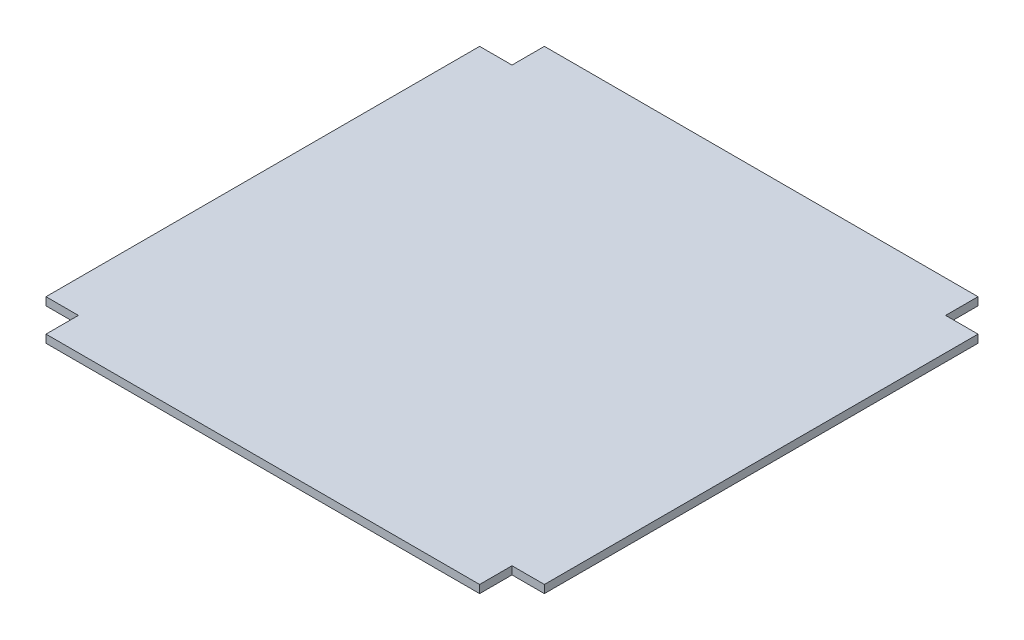
ISO-10303-21;
HEADER;
FILE_DESCRIPTION(('STEP AP214'),'2;1');
FILE_NAME('part.step','',(''),(''),'','','');
FILE_SCHEMA(('AUTOMOTIVE_DESIGN { 1 0 10303 214 1 1 1 1 }'));
ENDSEC;
DATA;
#1=APPLICATION_CONTEXT('core data for automotive mechanical design processes');
#2=APPLICATION_PROTOCOL_DEFINITION('international standard','automotive_design',2000,#1);
#3=PRODUCT_CONTEXT('',#1,'mechanical');
#4=PRODUCT('Part','Part','',(#3));
#5=PRODUCT_RELATED_PRODUCT_CATEGORY('part','',(#4));
#6=PRODUCT_DEFINITION_FORMATION('','',#4);
#7=PRODUCT_DEFINITION_CONTEXT('part definition',#1,'design');
#8=PRODUCT_DEFINITION('design','',#6,#7);
#9=PRODUCT_DEFINITION_SHAPE('','',#8);
#10=(LENGTH_UNIT() NAMED_UNIT(*) SI_UNIT(.MILLI.,.METRE.));
#11=(NAMED_UNIT(*) PLANE_ANGLE_UNIT() SI_UNIT($,.RADIAN.));
#12=(NAMED_UNIT(*) SI_UNIT($,.STERADIAN.) SOLID_ANGLE_UNIT());
#13=UNCERTAINTY_MEASURE_WITH_UNIT(LENGTH_MEASURE(1.E-05),#10,'distance_accuracy_value','');
#14=(GEOMETRIC_REPRESENTATION_CONTEXT(3) GLOBAL_UNCERTAINTY_ASSIGNED_CONTEXT((#13)) GLOBAL_UNIT_ASSIGNED_CONTEXT((#10,
#11,#12)) REPRESENTATION_CONTEXT('',''));
#15=CARTESIAN_POINT('',(0.,0.,0.));
#16=DIRECTION('',(0.,0.,1.));
#17=DIRECTION('',(1.,0.,0.));
#18=AXIS2_PLACEMENT_3D('',#15,#16,#17);
#19=CARTESIAN_POINT('',(-43.5,1.6,0.));
#20=DIRECTION('',(-1.,0.,0.));
#21=DIRECTION('',(0.,0.,1.));
#22=AXIS2_PLACEMENT_3D('',#19,#20,#21);
#23=PLANE('',#22);
#24=DIRECTION('',(0.,0.,-1.));
#25=VECTOR('',#24,1.);
#26=CARTESIAN_POINT('',(-43.5,0.,0.));
#27=LINE('',#26,#25);
#28=CARTESIAN_POINT('',(-43.5,0.,50.));
#29=VERTEX_POINT('',#28);
#30=CARTESIAN_POINT('',(-43.5,0.,43.5));
#31=VERTEX_POINT('',#30);
#32=EDGE_CURVE('E166',#29,#31,#27,.T.);
#33=ORIENTED_EDGE('',*,*,#32,.F.);
#34=DIRECTION('',(0.,-1.,0.));
#35=VECTOR('',#34,1.);
#36=CARTESIAN_POINT('',(-43.5,1.6,50.));
#37=LINE('',#36,#35);
#38=CARTESIAN_POINT('',(-43.5,1.6,50.));
#39=VERTEX_POINT('',#38);
#40=EDGE_CURVE('E11',#39,#29,#37,.T.);
#41=ORIENTED_EDGE('',*,*,#40,.F.);
#42=DIRECTION('',(0.,0.,-1.));
#43=VECTOR('',#42,1.);
#44=CARTESIAN_POINT('',(-43.5,1.6,0.));
#45=LINE('',#44,#43);
#46=CARTESIAN_POINT('',(-43.5,1.6,43.5));
#47=VERTEX_POINT('',#46);
#48=EDGE_CURVE('E208',#39,#47,#45,.T.);
#49=ORIENTED_EDGE('',*,*,#48,.T.);
#50=DIRECTION('',(0.,-1.,0.));
#51=VECTOR('',#50,1.);
#52=CARTESIAN_POINT('',(-43.5,1.6,43.5));
#53=LINE('',#52,#51);
#54=EDGE_CURVE('E104',#47,#31,#53,.T.);
#55=ORIENTED_EDGE('',*,*,#54,.T.);
#56=EDGE_LOOP('',(#33,#41,#49,#55));
#57=FACE_BOUND('',#56,.T.);
#58=ADVANCED_FACE('F41',(#57),#23,.T.);
#59=CARTESIAN_POINT('',(0.,1.6,50.));
#60=DIRECTION('',(0.,0.,-1.));
#61=DIRECTION('',(-1.,0.,0.));
#62=AXIS2_PLACEMENT_3D('',#59,#60,#61);
#63=PLANE('',#62);
#64=DIRECTION('',(1.,0.,0.));
#65=VECTOR('',#64,1.);
#66=CARTESIAN_POINT('',(0.,0.,50.));
#67=LINE('',#66,#65);
#68=CARTESIAN_POINT('',(43.5,0.,50.));
#69=VERTEX_POINT('',#68);
#70=EDGE_CURVE('E170',#29,#69,#67,.T.);
#71=ORIENTED_EDGE('',*,*,#70,.T.);
#72=DIRECTION('',(0.,-1.,0.));
#73=VECTOR('',#72,1.);
#74=CARTESIAN_POINT('',(43.5,1.6,50.));
#75=LINE('',#74,#73);
#76=CARTESIAN_POINT('',(43.5,1.6,50.));
#77=VERTEX_POINT('',#76);
#78=EDGE_CURVE('E50',#77,#69,#75,.T.);
#79=ORIENTED_EDGE('',*,*,#78,.F.);
#80=DIRECTION('',(1.,0.,0.));
#81=VECTOR('',#80,1.);
#82=CARTESIAN_POINT('',(0.,1.6,50.));
#83=LINE('',#82,#81);
#84=EDGE_CURVE('E262',#39,#77,#83,.T.);
#85=ORIENTED_EDGE('',*,*,#84,.F.);
#86=ORIENTED_EDGE('',*,*,#40,.T.);
#87=EDGE_LOOP('',(#71,#79,#85,#86));
#88=FACE_BOUND('',#87,.T.);
#89=ADVANCED_FACE('F294',(#88),#63,.F.);
#90=CARTESIAN_POINT('',(43.5,1.6,0.));
#91=DIRECTION('',(-1.,0.,0.));
#92=DIRECTION('',(0.,0.,1.));
#93=AXIS2_PLACEMENT_3D('',#90,#91,#92);
#94=PLANE('',#93);
#95=DIRECTION('',(0.,0.,-1.));
#96=VECTOR('',#95,1.);
#97=CARTESIAN_POINT('',(43.5,0.,0.));
#98=LINE('',#97,#96);
#99=CARTESIAN_POINT('',(43.5,0.,43.5));
#100=VERTEX_POINT('',#99);
#101=EDGE_CURVE('E173',#69,#100,#98,.T.);
#102=ORIENTED_EDGE('',*,*,#101,.T.);
#103=DIRECTION('',(0.,-1.,0.));
#104=VECTOR('',#103,1.);
#105=CARTESIAN_POINT('',(43.5,1.6,43.5));
#106=LINE('',#105,#104);
#107=CARTESIAN_POINT('',(43.5,1.6,43.5));
#108=VERTEX_POINT('',#107);
#109=EDGE_CURVE('E230',#108,#100,#106,.T.);
#110=ORIENTED_EDGE('',*,*,#109,.F.);
#111=DIRECTION('',(0.,0.,-1.));
#112=VECTOR('',#111,1.);
#113=CARTESIAN_POINT('',(43.5,1.6,0.));
#114=LINE('',#113,#112);
#115=EDGE_CURVE('E240',#77,#108,#114,.T.);
#116=ORIENTED_EDGE('',*,*,#115,.F.);
#117=ORIENTED_EDGE('',*,*,#78,.T.);
#118=EDGE_LOOP('',(#102,#110,#116,#117));
#119=FACE_BOUND('',#118,.T.);
#120=ADVANCED_FACE('F238',(#119),#94,.F.);
#121=CARTESIAN_POINT('',(0.,1.6,43.5));
#122=DIRECTION('',(0.,0.,1.));
#123=DIRECTION('',(1.,0.,0.));
#124=AXIS2_PLACEMENT_3D('',#121,#122,#123);
#125=PLANE('',#124);
#126=DIRECTION('',(-1.,0.,0.));
#127=VECTOR('',#126,1.);
#128=CARTESIAN_POINT('',(0.,0.,43.5));
#129=LINE('',#128,#127);
#130=CARTESIAN_POINT('',(50.,0.,43.5));
#131=VERTEX_POINT('',#130);
#132=EDGE_CURVE('E177',#131,#100,#129,.T.);
#133=ORIENTED_EDGE('',*,*,#132,.F.);
#134=DIRECTION('',(0.,-1.,0.));
#135=VECTOR('',#134,1.);
#136=CARTESIAN_POINT('',(50.,1.6,43.5));
#137=LINE('',#136,#135);
#138=CARTESIAN_POINT('',(50.,1.6,43.5));
#139=VERTEX_POINT('',#138);
#140=EDGE_CURVE('E227',#139,#131,#137,.T.);
#141=ORIENTED_EDGE('',*,*,#140,.F.);
#142=DIRECTION('',(-1.,0.,0.));
#143=VECTOR('',#142,1.);
#144=CARTESIAN_POINT('',(0.,1.6,43.5));
#145=LINE('',#144,#143);
#146=EDGE_CURVE('E252',#139,#108,#145,.T.);
#147=ORIENTED_EDGE('',*,*,#146,.T.);
#148=ORIENTED_EDGE('',*,*,#109,.T.);
#149=EDGE_LOOP('',(#133,#141,#147,#148));
#150=FACE_BOUND('',#149,.T.);
#151=ADVANCED_FACE('F249',(#150),#125,.T.);
#152=CARTESIAN_POINT('',(50.,1.6,0.));
#153=DIRECTION('',(1.,0.,0.));
#154=DIRECTION('',(0.,0.,-1.));
#155=AXIS2_PLACEMENT_3D('',#152,#153,#154);
#156=PLANE('',#155);
#157=DIRECTION('',(0.,0.,1.));
#158=VECTOR('',#157,1.);
#159=CARTESIAN_POINT('',(50.,0.,0.));
#160=LINE('',#159,#158);
#161=CARTESIAN_POINT('',(50.,0.,-43.5));
#162=VERTEX_POINT('',#161);
#163=EDGE_CURVE('E181',#162,#131,#160,.T.);
#164=ORIENTED_EDGE('',*,*,#163,.F.);
#165=DIRECTION('',(0.,-1.,0.));
#166=VECTOR('',#165,1.);
#167=CARTESIAN_POINT('',(50.,1.6,-43.5));
#168=LINE('',#167,#166);
#169=CARTESIAN_POINT('',(50.,1.6,-43.5));
#170=VERTEX_POINT('',#169);
#171=EDGE_CURVE('E224',#170,#162,#168,.T.);
#172=ORIENTED_EDGE('',*,*,#171,.F.);
#173=DIRECTION('',(0.,0.,1.));
#174=VECTOR('',#173,1.);
#175=CARTESIAN_POINT('',(50.,1.6,0.));
#176=LINE('',#175,#174);
#177=EDGE_CURVE('E256',#170,#139,#176,.T.);
#178=ORIENTED_EDGE('',*,*,#177,.T.);
#179=ORIENTED_EDGE('',*,*,#140,.T.);
#180=EDGE_LOOP('',(#164,#172,#178,#179));
#181=FACE_BOUND('',#180,.T.);
#182=ADVANCED_FACE('F364',(#181),#156,.T.);
#183=CARTESIAN_POINT('',(0.,1.6,-43.5));
#184=DIRECTION('',(0.,0.,1.));
#185=DIRECTION('',(1.,0.,0.));
#186=AXIS2_PLACEMENT_3D('',#183,#184,#185);
#187=PLANE('',#186);
#188=DIRECTION('',(-1.,0.,0.));
#189=VECTOR('',#188,1.);
#190=CARTESIAN_POINT('',(0.,0.,-43.5));
#191=LINE('',#190,#189);
#192=CARTESIAN_POINT('',(43.5,0.,-43.5));
#193=VERTEX_POINT('',#192);
#194=EDGE_CURVE('E185',#162,#193,#191,.T.);
#195=ORIENTED_EDGE('',*,*,#194,.T.);
#196=DIRECTION('',(0.,-1.,0.));
#197=VECTOR('',#196,1.);
#198=CARTESIAN_POINT('',(43.5,1.6,-43.5));
#199=LINE('',#198,#197);
#200=CARTESIAN_POINT('',(43.5,1.6,-43.5));
#201=VERTEX_POINT('',#200);
#202=EDGE_CURVE('E221',#201,#193,#199,.T.);
#203=ORIENTED_EDGE('',*,*,#202,.F.);
#204=DIRECTION('',(-1.,0.,0.));
#205=VECTOR('',#204,1.);
#206=CARTESIAN_POINT('',(0.,1.6,-43.5));
#207=LINE('',#206,#205);
#208=EDGE_CURVE('E260',#170,#201,#207,.T.);
#209=ORIENTED_EDGE('',*,*,#208,.F.);
#210=ORIENTED_EDGE('',*,*,#171,.T.);
#211=EDGE_LOOP('',(#195,#203,#209,#210));
#212=FACE_BOUND('',#211,.T.);
#213=ADVANCED_FACE('F355',(#212),#187,.F.);
#214=CARTESIAN_POINT('',(43.5,1.6,0.));
#215=DIRECTION('',(1.,0.,0.));
#216=DIRECTION('',(0.,0.,-1.));
#217=AXIS2_PLACEMENT_3D('',#214,#215,#216);
#218=PLANE('',#217);
#219=DIRECTION('',(0.,0.,1.));
#220=VECTOR('',#219,1.);
#221=CARTESIAN_POINT('',(43.5,0.,0.));
#222=LINE('',#221,#220);
#223=CARTESIAN_POINT('',(43.5,0.,-50.));
#224=VERTEX_POINT('',#223);
#225=EDGE_CURVE('E189',#224,#193,#222,.T.);
#226=ORIENTED_EDGE('',*,*,#225,.F.);
#227=DIRECTION('',(0.,-1.,0.));
#228=VECTOR('',#227,1.);
#229=CARTESIAN_POINT('',(43.5,1.6,-50.));
#230=LINE('',#229,#228);
#231=CARTESIAN_POINT('',(43.5,1.6,-50.));
#232=VERTEX_POINT('',#231);
#233=EDGE_CURVE('E218',#232,#224,#230,.T.);
#234=ORIENTED_EDGE('',*,*,#233,.F.);
#235=DIRECTION('',(0.,0.,1.));
#236=VECTOR('',#235,1.);
#237=CARTESIAN_POINT('',(43.5,1.6,0.));
#238=LINE('',#237,#236);
#239=EDGE_CURVE('E268',#232,#201,#238,.T.);
#240=ORIENTED_EDGE('',*,*,#239,.T.);
#241=ORIENTED_EDGE('',*,*,#202,.T.);
#242=EDGE_LOOP('',(#226,#234,#240,#241));
#243=FACE_BOUND('',#242,.T.);
#244=ADVANCED_FACE('F281',(#243),#218,.T.);
#245=CARTESIAN_POINT('',(0.,1.6,-50.));
#246=DIRECTION('',(0.,0.,-1.));
#247=DIRECTION('',(-1.,0.,0.));
#248=AXIS2_PLACEMENT_3D('',#245,#246,#247);
#249=PLANE('',#248);
#250=DIRECTION('',(1.,0.,0.));
#251=VECTOR('',#250,1.);
#252=CARTESIAN_POINT('',(0.,0.,-50.));
#253=LINE('',#252,#251);
#254=CARTESIAN_POINT('',(-43.5,0.,-50.));
#255=VERTEX_POINT('',#254);
#256=EDGE_CURVE('E193',#255,#224,#253,.T.);
#257=ORIENTED_EDGE('',*,*,#256,.F.);
#258=DIRECTION('',(0.,-1.,0.));
#259=VECTOR('',#258,1.);
#260=CARTESIAN_POINT('',(-43.5,1.6,-50.));
#261=LINE('',#260,#259);
#262=CARTESIAN_POINT('',(-43.5,1.6,-50.));
#263=VERTEX_POINT('',#262);
#264=EDGE_CURVE('E215',#263,#255,#261,.T.);
#265=ORIENTED_EDGE('',*,*,#264,.F.);
#266=DIRECTION('',(1.,0.,0.));
#267=VECTOR('',#266,1.);
#268=CARTESIAN_POINT('',(0.,1.6,-50.));
#269=LINE('',#268,#267);
#270=EDGE_CURVE('E160',#263,#232,#269,.T.);
#271=ORIENTED_EDGE('',*,*,#270,.T.);
#272=ORIENTED_EDGE('',*,*,#233,.T.);
#273=EDGE_LOOP('',(#257,#265,#271,#272));
#274=FACE_BOUND('',#273,.T.);
#275=ADVANCED_FACE('F275',(#274),#249,.T.);
#276=CARTESIAN_POINT('',(-43.5,1.6,0.));
#277=DIRECTION('',(1.,0.,0.));
#278=DIRECTION('',(0.,0.,-1.));
#279=AXIS2_PLACEMENT_3D('',#276,#277,#278);
#280=PLANE('',#279);
#281=DIRECTION('',(0.,0.,1.));
#282=VECTOR('',#281,1.);
#283=CARTESIAN_POINT('',(-43.5,0.,0.));
#284=LINE('',#283,#282);
#285=CARTESIAN_POINT('',(-43.5,0.,-43.5));
#286=VERTEX_POINT('',#285);
#287=EDGE_CURVE('E197',#255,#286,#284,.T.);
#288=ORIENTED_EDGE('',*,*,#287,.T.);
#289=DIRECTION('',(0.,-1.,0.));
#290=VECTOR('',#289,1.);
#291=CARTESIAN_POINT('',(-43.5,1.6,-43.5));
#292=LINE('',#291,#290);
#293=CARTESIAN_POINT('',(-43.5,1.6,-43.5));
#294=VERTEX_POINT('',#293);
#295=EDGE_CURVE('E145',#294,#286,#292,.T.);
#296=ORIENTED_EDGE('',*,*,#295,.F.);
#297=DIRECTION('',(0.,0.,1.));
#298=VECTOR('',#297,1.);
#299=CARTESIAN_POINT('',(-43.5,1.6,0.));
#300=LINE('',#299,#298);
#301=EDGE_CURVE('E155',#263,#294,#300,.T.);
#302=ORIENTED_EDGE('',*,*,#301,.F.);
#303=ORIENTED_EDGE('',*,*,#264,.T.);
#304=EDGE_LOOP('',(#288,#296,#302,#303));
#305=FACE_BOUND('',#304,.T.);
#306=ADVANCED_FACE('F284',(#305),#280,.F.);
#307=CARTESIAN_POINT('',(0.,1.6,-43.5));
#308=DIRECTION('',(0.,0.,-1.));
#309=DIRECTION('',(-1.,0.,0.));
#310=AXIS2_PLACEMENT_3D('',#307,#308,#309);
#311=PLANE('',#310);
#312=DIRECTION('',(1.,0.,0.));
#313=VECTOR('',#312,1.);
#314=CARTESIAN_POINT('',(0.,0.,-43.5));
#315=LINE('',#314,#313);
#316=CARTESIAN_POINT('',(-50.,0.,-43.5));
#317=VERTEX_POINT('',#316);
#318=EDGE_CURVE('E143',#317,#286,#315,.T.);
#319=ORIENTED_EDGE('',*,*,#318,.F.);
#320=DIRECTION('',(0.,-1.,0.));
#321=VECTOR('',#320,1.);
#322=CARTESIAN_POINT('',(-50.,1.6,-43.5));
#323=LINE('',#322,#321);
#324=CARTESIAN_POINT('',(-50.,1.6,-43.5));
#325=VERTEX_POINT('',#324);
#326=EDGE_CURVE('E137',#325,#317,#323,.T.);
#327=ORIENTED_EDGE('',*,*,#326,.F.);
#328=DIRECTION('',(1.,0.,0.));
#329=VECTOR('',#328,1.);
#330=CARTESIAN_POINT('',(0.,1.6,-43.5));
#331=LINE('',#330,#329);
#332=EDGE_CURVE('E141',#325,#294,#331,.T.);
#333=ORIENTED_EDGE('',*,*,#332,.T.);
#334=ORIENTED_EDGE('',*,*,#295,.T.);
#335=EDGE_LOOP('',(#319,#327,#333,#334));
#336=FACE_BOUND('',#335,.T.);
#337=ADVANCED_FACE('F139',(#336),#311,.T.);
#338=CARTESIAN_POINT('',(-50.,1.6,0.));
#339=DIRECTION('',(1.,0.,0.));
#340=DIRECTION('',(0.,0.,-1.));
#341=AXIS2_PLACEMENT_3D('',#338,#339,#340);
#342=PLANE('',#341);
#343=DIRECTION('',(0.,0.,1.));
#344=VECTOR('',#343,1.);
#345=CARTESIAN_POINT('',(-50.,0.,0.));
#346=LINE('',#345,#344);
#347=CARTESIAN_POINT('',(-50.,0.,43.5));
#348=VERTEX_POINT('',#347);
#349=EDGE_CURVE('E97',#317,#348,#346,.T.);
#350=ORIENTED_EDGE('',*,*,#349,.T.);
#351=DIRECTION('',(0.,-1.,0.));
#352=VECTOR('',#351,1.);
#353=CARTESIAN_POINT('',(-50.,1.6,43.5));
#354=LINE('',#353,#352);
#355=CARTESIAN_POINT('',(-50.,1.6,43.5));
#356=VERTEX_POINT('',#355);
#357=EDGE_CURVE('E146',#356,#348,#354,.T.);
#358=ORIENTED_EDGE('',*,*,#357,.F.);
#359=DIRECTION('',(0.,0.,1.));
#360=VECTOR('',#359,1.);
#361=CARTESIAN_POINT('',(-50.,1.6,0.));
#362=LINE('',#361,#360);
#363=EDGE_CURVE('E148',#325,#356,#362,.T.);
#364=ORIENTED_EDGE('',*,*,#363,.F.);
#365=ORIENTED_EDGE('',*,*,#326,.T.);
#366=EDGE_LOOP('',(#350,#358,#364,#365));
#367=FACE_BOUND('',#366,.T.);
#368=ADVANCED_FACE('F149',(#367),#342,.F.);
#369=CARTESIAN_POINT('',(0.,1.6,43.5));
#370=DIRECTION('',(0.,0.,-1.));
#371=DIRECTION('',(-1.,0.,0.));
#372=AXIS2_PLACEMENT_3D('',#369,#370,#371);
#373=PLANE('',#372);
#374=DIRECTION('',(1.,0.,0.));
#375=VECTOR('',#374,1.);
#376=CARTESIAN_POINT('',(0.,0.,43.5));
#377=LINE('',#376,#375);
#378=EDGE_CURVE('E205',#348,#31,#377,.T.);
#379=ORIENTED_EDGE('',*,*,#378,.T.);
#380=ORIENTED_EDGE('',*,*,#54,.F.);
#381=DIRECTION('',(1.,0.,0.));
#382=VECTOR('',#381,1.);
#383=CARTESIAN_POINT('',(0.,1.6,43.5));
#384=LINE('',#383,#382);
#385=EDGE_CURVE('E58',#356,#47,#384,.T.);
#386=ORIENTED_EDGE('',*,*,#385,.F.);
#387=ORIENTED_EDGE('',*,*,#357,.T.);
#388=EDGE_LOOP('',(#379,#380,#386,#387));
#389=FACE_BOUND('',#388,.T.);
#390=ADVANCED_FACE('F300',(#389),#373,.F.);
#391=CARTESIAN_POINT('',(0.,1.6,0.));
#392=DIRECTION('',(0.,1.,0.));
#393=DIRECTION('',(0.,0.,1.));
#394=AXIS2_PLACEMENT_3D('',#391,#392,#393);
#395=PLANE('',#394);
#396=ORIENTED_EDGE('',*,*,#48,.F.);
#397=ORIENTED_EDGE('',*,*,#84,.T.);
#398=ORIENTED_EDGE('',*,*,#115,.T.);
#399=ORIENTED_EDGE('',*,*,#146,.F.);
#400=ORIENTED_EDGE('',*,*,#177,.F.);
#401=ORIENTED_EDGE('',*,*,#208,.T.);
#402=ORIENTED_EDGE('',*,*,#239,.F.);
#403=ORIENTED_EDGE('',*,*,#270,.F.);
#404=ORIENTED_EDGE('',*,*,#301,.T.);
#405=ORIENTED_EDGE('',*,*,#332,.F.);
#406=ORIENTED_EDGE('',*,*,#363,.T.);
#407=ORIENTED_EDGE('',*,*,#385,.T.);
#408=EDGE_LOOP('',(#396,#397,#398,#399,#400,#401,#402,#403,#404,#405,#406,#407));
#409=FACE_BOUND('',#408,.T.);
#410=ADVANCED_FACE('F152',(#409),#395,.T.);
#411=CARTESIAN_POINT('',(0.,0.,0.));
#412=DIRECTION('',(0.,1.,0.));
#413=DIRECTION('',(0.,0.,1.));
#414=AXIS2_PLACEMENT_3D('',#411,#412,#413);
#415=PLANE('',#414);
#416=ORIENTED_EDGE('',*,*,#32,.T.);
#417=ORIENTED_EDGE('',*,*,#378,.F.);
#418=ORIENTED_EDGE('',*,*,#349,.F.);
#419=ORIENTED_EDGE('',*,*,#318,.T.);
#420=ORIENTED_EDGE('',*,*,#287,.F.);
#421=ORIENTED_EDGE('',*,*,#256,.T.);
#422=ORIENTED_EDGE('',*,*,#225,.T.);
#423=ORIENTED_EDGE('',*,*,#194,.F.);
#424=ORIENTED_EDGE('',*,*,#163,.T.);
#425=ORIENTED_EDGE('',*,*,#132,.T.);
#426=ORIENTED_EDGE('',*,*,#101,.F.);
#427=ORIENTED_EDGE('',*,*,#70,.F.);
#428=EDGE_LOOP('',(#416,#417,#418,#419,#420,#421,#422,#423,#424,#425,#426,#427));
#429=FACE_BOUND('',#428,.T.);
#430=ADVANCED_FACE('F244',(#429),#415,.F.);
#431=CLOSED_SHELL('',(#58,#89,#120,#151,#182,#213,#244,#275,#306,#337,#368,#390,#410,#430));
#432=MANIFOLD_SOLID_BREP('B2',#431);
#433=ADVANCED_BREP_SHAPE_REPRESENTATION('',(#18,#432),#14);
#434=SHAPE_DEFINITION_REPRESENTATION(#9,#433);
ENDSEC;
END-ISO-10303-21;
